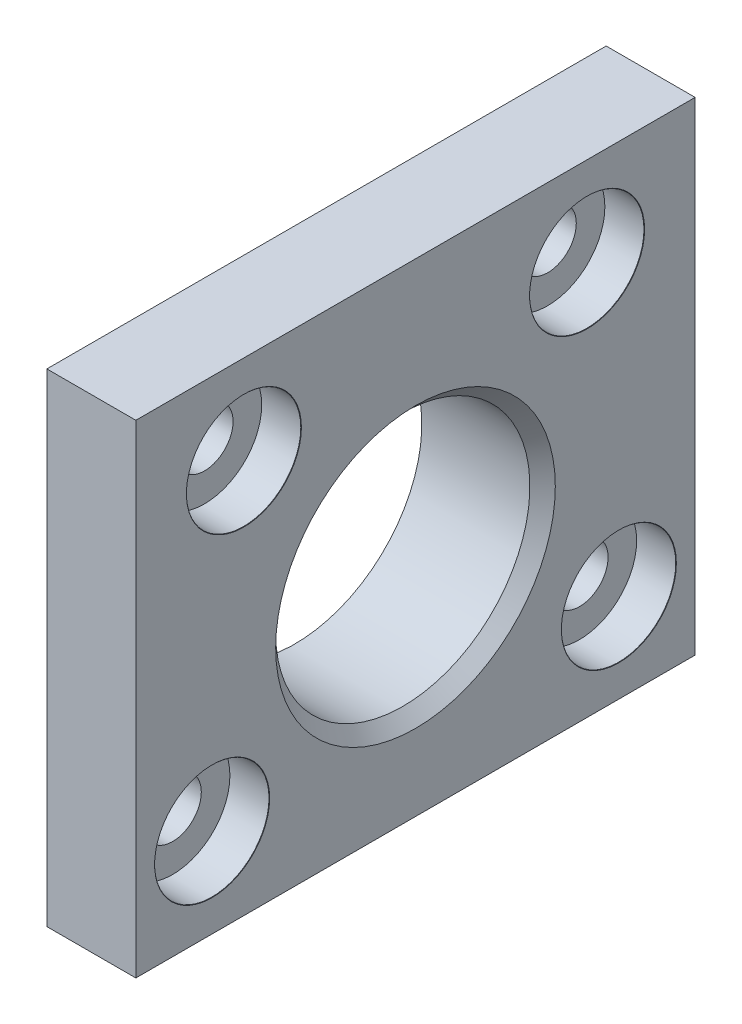
ISO-10303-21;
HEADER;
FILE_DESCRIPTION(('STEP AP214'),'2;1');
FILE_NAME('part.step','',(''),(''),'','','');
FILE_SCHEMA(('AUTOMOTIVE_DESIGN { 1 0 10303 214 1 1 1 1 }'));
ENDSEC;
DATA;
#1=APPLICATION_CONTEXT('core data for automotive mechanical design processes');
#2=APPLICATION_PROTOCOL_DEFINITION('international standard','automotive_design',2000,#1);
#3=PRODUCT_CONTEXT('',#1,'mechanical');
#4=PRODUCT('Part','Part','',(#3));
#5=PRODUCT_RELATED_PRODUCT_CATEGORY('part','',(#4));
#6=PRODUCT_DEFINITION_FORMATION('','',#4);
#7=PRODUCT_DEFINITION_CONTEXT('part definition',#1,'design');
#8=PRODUCT_DEFINITION('design','',#6,#7);
#9=PRODUCT_DEFINITION_SHAPE('','',#8);
#10=(LENGTH_UNIT() NAMED_UNIT(*) SI_UNIT(.MILLI.,.METRE.));
#11=(NAMED_UNIT(*) PLANE_ANGLE_UNIT() SI_UNIT($,.RADIAN.));
#12=(NAMED_UNIT(*) SI_UNIT($,.STERADIAN.) SOLID_ANGLE_UNIT());
#13=UNCERTAINTY_MEASURE_WITH_UNIT(LENGTH_MEASURE(1.E-05),#10,'distance_accuracy_value','');
#14=(GEOMETRIC_REPRESENTATION_CONTEXT(3) GLOBAL_UNCERTAINTY_ASSIGNED_CONTEXT((#13)) GLOBAL_UNIT_ASSIGNED_CONTEXT((#10,
#11,#12)) REPRESENTATION_CONTEXT('',''));
#15=CARTESIAN_POINT('',(0.,0.,0.));
#16=DIRECTION('',(0.,0.,1.));
#17=DIRECTION('',(1.,0.,0.));
#18=AXIS2_PLACEMENT_3D('',#15,#16,#17);
#19=CARTESIAN_POINT('',(-7.,0.,0.));
#20=DIRECTION('',(-1.,0.,0.));
#21=DIRECTION('',(0.,0.,1.));
#22=AXIS2_PLACEMENT_3D('',#19,#20,#21);
#23=PLANE('',#22);
#24=CARTESIAN_POINT('',(-7.,31.,-8.5));
#25=DIRECTION('',(-1.,0.,0.));
#26=DIRECTION('',(0.,0.,1.));
#27=AXIS2_PLACEMENT_3D('',#24,#25,#26);
#28=CIRCLE('',#27,2.25);
#29=CARTESIAN_POINT('',(-7.,31.,-6.25));
#30=VERTEX_POINT('',#29);
#31=EDGE_CURVE('E45',#30,#30,#28,.T.);
#32=ORIENTED_EDGE('',*,*,#31,.F.);
#33=EDGE_LOOP('',(#32));
#34=FACE_BOUND('',#33,.T.);
#35=CARTESIAN_POINT('',(-7.,31.,-35.5));
#36=DIRECTION('',(-1.,0.,0.));
#37=DIRECTION('',(0.,0.,1.));
#38=AXIS2_PLACEMENT_3D('',#35,#36,#37);
#39=CIRCLE('',#38,2.25);
#40=CARTESIAN_POINT('',(-7.,31.,-33.25));
#41=VERTEX_POINT('',#40);
#42=EDGE_CURVE('E151',#41,#41,#39,.T.);
#43=ORIENTED_EDGE('',*,*,#42,.F.);
#44=EDGE_LOOP('',(#43));
#45=FACE_BOUND('',#44,.T.);
#46=CARTESIAN_POINT('',(-7.,7.,-38.));
#47=DIRECTION('',(-1.,0.,0.));
#48=DIRECTION('',(0.,0.,1.));
#49=AXIS2_PLACEMENT_3D('',#46,#47,#48);
#50=CIRCLE('',#49,2.25);
#51=CARTESIAN_POINT('',(-7.,7.,-35.75));
#52=VERTEX_POINT('',#51);
#53=EDGE_CURVE('E146',#52,#52,#50,.T.);
#54=ORIENTED_EDGE('',*,*,#53,.F.);
#55=EDGE_LOOP('',(#54));
#56=FACE_BOUND('',#55,.T.);
#57=CARTESIAN_POINT('',(-7.,7.,-6.));
#58=DIRECTION('',(-1.,0.,0.));
#59=DIRECTION('',(0.,0.,1.));
#60=AXIS2_PLACEMENT_3D('',#57,#58,#59);
#61=CIRCLE('',#60,2.25);
#62=CARTESIAN_POINT('',(-7.,7.,-3.75));
#63=VERTEX_POINT('',#62);
#64=EDGE_CURVE('E140',#63,#63,#61,.T.);
#65=ORIENTED_EDGE('',*,*,#64,.F.);
#66=EDGE_LOOP('',(#65));
#67=FACE_BOUND('',#66,.T.);
#68=DIRECTION('',(0.,1.,0.));
#69=VECTOR('',#68,1.);
#70=CARTESIAN_POINT('',(-7.,38.,-44.));
#71=LINE('',#70,#69);
#72=CARTESIAN_POINT('',(-7.,0.,-44.));
#73=VERTEX_POINT('',#72);
#74=CARTESIAN_POINT('',(-7.,38.,-44.));
#75=VERTEX_POINT('',#74);
#76=EDGE_CURVE('E109',#73,#75,#71,.T.);
#77=ORIENTED_EDGE('',*,*,#76,.F.);
#78=DIRECTION('',(0.,0.,-1.));
#79=VECTOR('',#78,1.);
#80=CARTESIAN_POINT('',(-7.,0.,-44.));
#81=LINE('',#80,#79);
#82=CARTESIAN_POINT('',(-7.,0.,0.));
#83=VERTEX_POINT('',#82);
#84=EDGE_CURVE('E104',#83,#73,#81,.T.);
#85=ORIENTED_EDGE('',*,*,#84,.F.);
#86=DIRECTION('',(0.,-1.,0.));
#87=VECTOR('',#86,1.);
#88=CARTESIAN_POINT('',(-7.,38.,0.));
#89=LINE('',#88,#87);
#90=CARTESIAN_POINT('',(-7.,38.,0.));
#91=VERTEX_POINT('',#90);
#92=EDGE_CURVE('E95',#91,#83,#89,.T.);
#93=ORIENTED_EDGE('',*,*,#92,.F.);
#94=DIRECTION('',(0.,0.,1.));
#95=VECTOR('',#94,1.);
#96=CARTESIAN_POINT('',(-7.,38.,-44.));
#97=LINE('',#96,#95);
#98=EDGE_CURVE('E103',#75,#91,#97,.T.);
#99=ORIENTED_EDGE('',*,*,#98,.F.);
#100=EDGE_LOOP('',(#77,#85,#93,#99));
#101=FACE_BOUND('',#100,.T.);
#102=CARTESIAN_POINT('',(-7.,17.,-22.));
#103=DIRECTION('',(-1.,0.,0.));
#104=DIRECTION('',(0.,0.,1.));
#105=AXIS2_PLACEMENT_3D('',#102,#103,#104);
#106=CIRCLE('',#105,15.4);
#107=CARTESIAN_POINT('',(-7.,17.,-6.6));
#108=VERTEX_POINT('',#107);
#109=EDGE_CURVE('E201',#108,#108,#106,.T.);
#110=ORIENTED_EDGE('',*,*,#109,.F.);
#111=EDGE_LOOP('',(#110));
#112=FACE_BOUND('',#111,.T.);
#113=ADVANCED_FACE('F40',(#34,#45,#56,#67,#101,#112),#23,.T.);
#114=CARTESIAN_POINT('',(-7.,38.,-44.));
#115=DIRECTION('',(0.,0.,-1.));
#116=DIRECTION('',(0.,1.,0.));
#117=AXIS2_PLACEMENT_3D('',#114,#115,#116);
#118=PLANE('',#117);
#119=DIRECTION('',(0.,1.,0.));
#120=VECTOR('',#119,1.);
#121=CARTESIAN_POINT('',(0.,38.,-44.));
#122=LINE('',#121,#120);
#123=CARTESIAN_POINT('',(0.,0.,-44.));
#124=VERTEX_POINT('',#123);
#125=CARTESIAN_POINT('',(0.,38.,-44.));
#126=VERTEX_POINT('',#125);
#127=EDGE_CURVE('E118',#124,#126,#122,.T.);
#128=ORIENTED_EDGE('',*,*,#127,.F.);
#129=DIRECTION('',(1.,0.,0.));
#130=VECTOR('',#129,1.);
#131=CARTESIAN_POINT('',(-7.,0.,-44.));
#132=LINE('',#131,#130);
#133=EDGE_CURVE('E61',#73,#124,#132,.T.);
#134=ORIENTED_EDGE('',*,*,#133,.F.);
#135=ORIENTED_EDGE('',*,*,#76,.T.);
#136=DIRECTION('',(1.,0.,0.));
#137=VECTOR('',#136,1.);
#138=CARTESIAN_POINT('',(-7.,38.,-44.));
#139=LINE('',#138,#137);
#140=EDGE_CURVE('E89',#75,#126,#139,.T.);
#141=ORIENTED_EDGE('',*,*,#140,.T.);
#142=EDGE_LOOP('',(#128,#134,#135,#141));
#143=FACE_BOUND('',#142,.T.);
#144=ADVANCED_FACE('F210',(#143),#118,.T.);
#145=CARTESIAN_POINT('',(-7.,0.,-44.));
#146=DIRECTION('',(0.,-1.,0.));
#147=DIRECTION('',(0.,0.,-1.));
#148=AXIS2_PLACEMENT_3D('',#145,#146,#147);
#149=PLANE('',#148);
#150=DIRECTION('',(0.,0.,-1.));
#151=VECTOR('',#150,1.);
#152=CARTESIAN_POINT('',(0.,0.,-44.));
#153=LINE('',#152,#151);
#154=CARTESIAN_POINT('',(0.,0.,0.));
#155=VERTEX_POINT('',#154);
#156=EDGE_CURVE('E112',#155,#124,#153,.T.);
#157=ORIENTED_EDGE('',*,*,#156,.F.);
#158=DIRECTION('',(1.,0.,0.));
#159=VECTOR('',#158,1.);
#160=CARTESIAN_POINT('',(-7.,0.,0.));
#161=LINE('',#160,#159);
#162=EDGE_CURVE('E78',#83,#155,#161,.T.);
#163=ORIENTED_EDGE('',*,*,#162,.F.);
#164=ORIENTED_EDGE('',*,*,#84,.T.);
#165=ORIENTED_EDGE('',*,*,#133,.T.);
#166=EDGE_LOOP('',(#157,#163,#164,#165));
#167=FACE_BOUND('',#166,.T.);
#168=ADVANCED_FACE('F218',(#167),#149,.T.);
#169=CARTESIAN_POINT('',(-7.,38.,0.));
#170=DIRECTION('',(0.,0.,1.));
#171=DIRECTION('',(0.,-1.,0.));
#172=AXIS2_PLACEMENT_3D('',#169,#170,#171);
#173=PLANE('',#172);
#174=DIRECTION('',(0.,-1.,0.));
#175=VECTOR('',#174,1.);
#176=CARTESIAN_POINT('',(0.,38.,0.));
#177=LINE('',#176,#175);
#178=CARTESIAN_POINT('',(0.,38.,0.));
#179=VERTEX_POINT('',#178);
#180=EDGE_CURVE('E97',#179,#155,#177,.T.);
#181=ORIENTED_EDGE('',*,*,#180,.F.);
#182=DIRECTION('',(1.,0.,0.));
#183=VECTOR('',#182,1.);
#184=CARTESIAN_POINT('',(-7.,38.,0.));
#185=LINE('',#184,#183);
#186=EDGE_CURVE('E92',#91,#179,#185,.T.);
#187=ORIENTED_EDGE('',*,*,#186,.F.);
#188=ORIENTED_EDGE('',*,*,#92,.T.);
#189=ORIENTED_EDGE('',*,*,#162,.T.);
#190=EDGE_LOOP('',(#181,#187,#188,#189));
#191=FACE_BOUND('',#190,.T.);
#192=ADVANCED_FACE('F94',(#191),#173,.T.);
#193=CARTESIAN_POINT('',(-7.,38.,-44.));
#194=DIRECTION('',(0.,1.,0.));
#195=DIRECTION('',(0.,0.,1.));
#196=AXIS2_PLACEMENT_3D('',#193,#194,#195);
#197=PLANE('',#196);
#198=DIRECTION('',(0.,0.,1.));
#199=VECTOR('',#198,1.);
#200=CARTESIAN_POINT('',(0.,38.,-44.));
#201=LINE('',#200,#199);
#202=EDGE_CURVE('E122',#126,#179,#201,.T.);
#203=ORIENTED_EDGE('',*,*,#202,.F.);
#204=ORIENTED_EDGE('',*,*,#140,.F.);
#205=ORIENTED_EDGE('',*,*,#98,.T.);
#206=ORIENTED_EDGE('',*,*,#186,.T.);
#207=EDGE_LOOP('',(#203,#204,#205,#206));
#208=FACE_BOUND('',#207,.T.);
#209=ADVANCED_FACE('F107',(#208),#197,.T.);
#210=CARTESIAN_POINT('',(0.,0.,0.));
#211=DIRECTION('',(-1.,0.,0.));
#212=DIRECTION('',(0.,0.,1.));
#213=AXIS2_PLACEMENT_3D('',#210,#211,#212);
#214=PLANE('',#213);
#215=CARTESIAN_POINT('',(0.,31.,-8.5));
#216=DIRECTION('',(1.,0.,0.));
#217=DIRECTION('',(0.,0.,-1.));
#218=AXIS2_PLACEMENT_3D('',#215,#216,#217);
#219=CIRCLE('',#218,4.525);
#220=CARTESIAN_POINT('',(0.,31.,-13.025));
#221=VERTEX_POINT('',#220);
#222=EDGE_CURVE('E468',#221,#221,#219,.T.);
#223=ORIENTED_EDGE('',*,*,#222,.F.);
#224=EDGE_LOOP('',(#223));
#225=FACE_BOUND('',#224,.T.);
#226=CARTESIAN_POINT('',(0.,31.,-35.5));
#227=DIRECTION('',(1.,0.,0.));
#228=DIRECTION('',(0.,0.,-1.));
#229=AXIS2_PLACEMENT_3D('',#226,#227,#228);
#230=CIRCLE('',#229,4.525);
#231=CARTESIAN_POINT('',(0.,31.,-40.025));
#232=VERTEX_POINT('',#231);
#233=EDGE_CURVE('E482',#232,#232,#230,.T.);
#234=ORIENTED_EDGE('',*,*,#233,.F.);
#235=EDGE_LOOP('',(#234));
#236=FACE_BOUND('',#235,.T.);
#237=CARTESIAN_POINT('',(0.,7.,-38.));
#238=DIRECTION('',(1.,0.,0.));
#239=DIRECTION('',(0.,0.,-1.));
#240=AXIS2_PLACEMENT_3D('',#237,#238,#239);
#241=CIRCLE('',#240,4.525);
#242=CARTESIAN_POINT('',(0.,7.,-42.525));
#243=VERTEX_POINT('',#242);
#244=EDGE_CURVE('E154',#243,#243,#241,.T.);
#245=ORIENTED_EDGE('',*,*,#244,.F.);
#246=EDGE_LOOP('',(#245));
#247=FACE_BOUND('',#246,.T.);
#248=CARTESIAN_POINT('',(0.,7.,-6.));
#249=DIRECTION('',(1.,0.,0.));
#250=DIRECTION('',(0.,0.,-1.));
#251=AXIS2_PLACEMENT_3D('',#248,#249,#250);
#252=CIRCLE('',#251,4.525);
#253=CARTESIAN_POINT('',(0.,7.,-10.525));
#254=VERTEX_POINT('',#253);
#255=EDGE_CURVE('E149',#254,#254,#252,.T.);
#256=ORIENTED_EDGE('',*,*,#255,.F.);
#257=EDGE_LOOP('',(#256));
#258=FACE_BOUND('',#257,.T.);
#259=CARTESIAN_POINT('',(0.,17.,-22.));
#260=DIRECTION('',(-1.,0.,0.));
#261=DIRECTION('',(0.,0.,1.));
#262=AXIS2_PLACEMENT_3D('',#259,#260,#261);
#263=CIRCLE('',#262,11.);
#264=CARTESIAN_POINT('',(0.,17.,-11.));
#265=VERTEX_POINT('',#264);
#266=EDGE_CURVE('E11',#265,#265,#263,.T.);
#267=ORIENTED_EDGE('',*,*,#266,.T.);
#268=EDGE_LOOP('',(#267));
#269=FACE_BOUND('',#268,.T.);
#270=ORIENTED_EDGE('',*,*,#127,.T.);
#271=ORIENTED_EDGE('',*,*,#202,.T.);
#272=ORIENTED_EDGE('',*,*,#180,.T.);
#273=ORIENTED_EDGE('',*,*,#156,.T.);
#274=EDGE_LOOP('',(#270,#271,#272,#273));
#275=FACE_BOUND('',#274,.T.);
#276=ADVANCED_FACE('F225',(#225,#236,#247,#258,#269,#275),#214,.F.);
#277=CARTESIAN_POINT('',(-7.,17.,-22.));
#278=DIRECTION('',(1.,0.,0.));
#279=DIRECTION('',(0.,0.,-1.));
#280=AXIS2_PLACEMENT_3D('',#277,#278,#279);
#281=CYLINDRICAL_SURFACE('',#280,10.);
#282=CARTESIAN_POINT('',(-1.,17.,-22.));
#283=DIRECTION('',(-1.,0.,0.));
#284=DIRECTION('',(0.,0.,1.));
#285=AXIS2_PLACEMENT_3D('',#282,#283,#284);
#286=CIRCLE('',#285,10.);
#287=CARTESIAN_POINT('',(-1.,17.,-12.));
#288=VERTEX_POINT('',#287);
#289=EDGE_CURVE('E52',#288,#288,#286,.F.);
#290=ORIENTED_EDGE('',*,*,#289,.T.);
#291=EDGE_LOOP('',(#290));
#292=FACE_BOUND('',#291,.T.);
#293=CARTESIAN_POINT('',(-9.5,17.,-22.));
#294=DIRECTION('',(-1.,0.,0.));
#295=DIRECTION('',(0.,0.,1.));
#296=AXIS2_PLACEMENT_3D('',#293,#294,#295);
#297=CIRCLE('',#296,10.);
#298=CARTESIAN_POINT('',(-9.5,17.,-12.));
#299=VERTEX_POINT('',#298);
#300=EDGE_CURVE('E144',#299,#299,#297,.T.);
#301=ORIENTED_EDGE('',*,*,#300,.T.);
#302=EDGE_LOOP('',(#301));
#303=FACE_BOUND('',#302,.T.);
#304=ADVANCED_FACE('F223',(#292,#303),#281,.F.);
#305=CARTESIAN_POINT('',(-9.5,17.,-22.));
#306=DIRECTION('',(-1.,0.,0.));
#307=DIRECTION('',(0.,0.,1.));
#308=AXIS2_PLACEMENT_3D('',#305,#306,#307);
#309=PLANE('',#308);
#310=CARTESIAN_POINT('',(-9.5,17.,-22.));
#311=DIRECTION('',(-1.,0.,0.));
#312=DIRECTION('',(0.,0.,1.));
#313=AXIS2_PLACEMENT_3D('',#310,#311,#312);
#314=CIRCLE('',#313,15.4);
#315=CARTESIAN_POINT('',(-9.5,17.,-6.6));
#316=VERTEX_POINT('',#315);
#317=EDGE_CURVE('E123',#316,#316,#314,.T.);
#318=ORIENTED_EDGE('',*,*,#317,.T.);
#319=EDGE_LOOP('',(#318));
#320=FACE_BOUND('',#319,.T.);
#321=ORIENTED_EDGE('',*,*,#300,.F.);
#322=EDGE_LOOP('',(#321));
#323=FACE_BOUND('',#322,.T.);
#324=ADVANCED_FACE('F252',(#320,#323),#309,.T.);
#325=CARTESIAN_POINT('',(-9.5,17.,-22.));
#326=DIRECTION('',(1.,0.,0.));
#327=DIRECTION('',(0.,0.,-1.));
#328=AXIS2_PLACEMENT_3D('',#325,#326,#327);
#329=CYLINDRICAL_SURFACE('',#328,15.4);
#330=ORIENTED_EDGE('',*,*,#317,.F.);
#331=EDGE_LOOP('',(#330));
#332=FACE_BOUND('',#331,.T.);
#333=ORIENTED_EDGE('',*,*,#109,.T.);
#334=EDGE_LOOP('',(#333));
#335=FACE_BOUND('',#334,.T.);
#336=ADVANCED_FACE('F208',(#332,#335),#329,.T.);
#337=CARTESIAN_POINT('',(-1.,17.,-22.));
#338=DIRECTION('',(1.,0.,0.));
#339=DIRECTION('',(0.,0.,-1.));
#340=AXIS2_PLACEMENT_3D('',#337,#338,#339);
#341=CONICAL_SURFACE('',#340,10.,0.785398163397448);
#342=ORIENTED_EDGE('',*,*,#266,.F.);
#343=EDGE_LOOP('',(#342));
#344=FACE_BOUND('',#343,.T.);
#345=ORIENTED_EDGE('',*,*,#289,.F.);
#346=EDGE_LOOP('',(#345));
#347=FACE_BOUND('',#346,.T.);
#348=ADVANCED_FACE('F43',(#344,#347),#341,.F.);
#349=CARTESIAN_POINT('',(0.,7.,-6.));
#350=DIRECTION('',(1.,0.,0.));
#351=DIRECTION('',(0.,0.,-1.));
#352=AXIS2_PLACEMENT_3D('',#349,#350,#351);
#353=CYLINDRICAL_SURFACE('',#352,2.25);
#354=ORIENTED_EDGE('',*,*,#64,.T.);
#355=EDGE_LOOP('',(#354));
#356=FACE_BOUND('',#355,.T.);
#357=CARTESIAN_POINT('',(-3.1,7.,-6.));
#358=DIRECTION('',(1.,0.,0.));
#359=DIRECTION('',(0.,0.,-1.));
#360=AXIS2_PLACEMENT_3D('',#357,#358,#359);
#361=CIRCLE('',#360,2.25);
#362=CARTESIAN_POINT('',(-3.1,7.,-8.25));
#363=VERTEX_POINT('',#362);
#364=EDGE_CURVE('E145',#363,#363,#361,.T.);
#365=ORIENTED_EDGE('',*,*,#364,.T.);
#366=EDGE_LOOP('',(#365));
#367=FACE_BOUND('',#366,.T.);
#368=ADVANCED_FACE('F270',(#356,#367),#353,.F.);
#369=CARTESIAN_POINT('',(-3.1,11.5,-6.));
#370=DIRECTION('',(-1.,0.,0.));
#371=DIRECTION('',(0.,0.,1.));
#372=AXIS2_PLACEMENT_3D('',#369,#370,#371);
#373=PLANE('',#372);
#374=ORIENTED_EDGE('',*,*,#364,.F.);
#375=EDGE_LOOP('',(#374));
#376=FACE_BOUND('',#375,.T.);
#377=CARTESIAN_POINT('',(-3.1,7.,-6.));
#378=DIRECTION('',(1.,0.,0.));
#379=DIRECTION('',(0.,0.,-1.));
#380=AXIS2_PLACEMENT_3D('',#377,#378,#379);
#381=CIRCLE('',#380,4.5);
#382=CARTESIAN_POINT('',(-3.1,7.,-10.5));
#383=VERTEX_POINT('',#382);
#384=EDGE_CURVE('E191',#383,#383,#381,.T.);
#385=ORIENTED_EDGE('',*,*,#384,.T.);
#386=EDGE_LOOP('',(#385));
#387=FACE_BOUND('',#386,.T.);
#388=ADVANCED_FACE('F276',(#376,#387),#373,.F.);
#389=CARTESIAN_POINT('',(0.,7.,-6.));
#390=DIRECTION('',(1.,0.,0.));
#391=DIRECTION('',(0.,0.,-1.));
#392=AXIS2_PLACEMENT_3D('',#389,#390,#391);
#393=CYLINDRICAL_SURFACE('',#392,4.5);
#394=ORIENTED_EDGE('',*,*,#384,.F.);
#395=EDGE_LOOP('',(#394));
#396=FACE_BOUND('',#395,.T.);
#397=CARTESIAN_POINT('',(-0.0250000000000003,7.,-6.));
#398=DIRECTION('',(1.,0.,0.));
#399=DIRECTION('',(0.,0.,-1.));
#400=AXIS2_PLACEMENT_3D('',#397,#398,#399);
#401=CIRCLE('',#400,4.5);
#402=CARTESIAN_POINT('',(-0.0250000000000003,7.,-10.5));
#403=VERTEX_POINT('',#402);
#404=EDGE_CURVE('E187',#403,#403,#401,.T.);
#405=ORIENTED_EDGE('',*,*,#404,.T.);
#406=EDGE_LOOP('',(#405));
#407=FACE_BOUND('',#406,.T.);
#408=ADVANCED_FACE('F284',(#396,#407),#393,.F.);
#409=CARTESIAN_POINT('',(0.,7.,-6.));
#410=DIRECTION('',(1.,0.,0.));
#411=DIRECTION('',(0.,0.,-1.));
#412=AXIS2_PLACEMENT_3D('',#409,#410,#411);
#413=CONICAL_SURFACE('',#412,4.525,0.785398163397457);
#414=ORIENTED_EDGE('',*,*,#404,.F.);
#415=EDGE_LOOP('',(#414));
#416=FACE_BOUND('',#415,.T.);
#417=ORIENTED_EDGE('',*,*,#255,.T.);
#418=EDGE_LOOP('',(#417));
#419=FACE_BOUND('',#418,.T.);
#420=ADVANCED_FACE('F292',(#416,#419),#413,.F.);
#421=CARTESIAN_POINT('',(0.,7.,-38.));
#422=DIRECTION('',(1.,0.,0.));
#423=DIRECTION('',(0.,0.,-1.));
#424=AXIS2_PLACEMENT_3D('',#421,#422,#423);
#425=CYLINDRICAL_SURFACE('',#424,2.25);
#426=ORIENTED_EDGE('',*,*,#53,.T.);
#427=EDGE_LOOP('',(#426));
#428=FACE_BOUND('',#427,.T.);
#429=CARTESIAN_POINT('',(-3.1,7.,-38.));
#430=DIRECTION('',(1.,0.,0.));
#431=DIRECTION('',(0.,0.,-1.));
#432=AXIS2_PLACEMENT_3D('',#429,#430,#431);
#433=CIRCLE('',#432,2.25);
#434=CARTESIAN_POINT('',(-3.1,7.,-40.25));
#435=VERTEX_POINT('',#434);
#436=EDGE_CURVE('E150',#435,#435,#433,.T.);
#437=ORIENTED_EDGE('',*,*,#436,.T.);
#438=EDGE_LOOP('',(#437));
#439=FACE_BOUND('',#438,.T.);
#440=ADVANCED_FACE('F300',(#428,#439),#425,.F.);
#441=CARTESIAN_POINT('',(-3.1,11.5,-38.));
#442=DIRECTION('',(-1.,0.,0.));
#443=DIRECTION('',(0.,0.,1.));
#444=AXIS2_PLACEMENT_3D('',#441,#442,#443);
#445=PLANE('',#444);
#446=ORIENTED_EDGE('',*,*,#436,.F.);
#447=EDGE_LOOP('',(#446));
#448=FACE_BOUND('',#447,.T.);
#449=CARTESIAN_POINT('',(-3.1,7.,-38.));
#450=DIRECTION('',(1.,0.,0.));
#451=DIRECTION('',(0.,0.,-1.));
#452=AXIS2_PLACEMENT_3D('',#449,#450,#451);
#453=CIRCLE('',#452,4.5);
#454=CARTESIAN_POINT('',(-3.1,7.,-42.5));
#455=VERTEX_POINT('',#454);
#456=EDGE_CURVE('E177',#455,#455,#453,.T.);
#457=ORIENTED_EDGE('',*,*,#456,.T.);
#458=EDGE_LOOP('',(#457));
#459=FACE_BOUND('',#458,.T.);
#460=ADVANCED_FACE('F308',(#448,#459),#445,.F.);
#461=CARTESIAN_POINT('',(0.,7.,-38.));
#462=DIRECTION('',(1.,0.,0.));
#463=DIRECTION('',(0.,0.,-1.));
#464=AXIS2_PLACEMENT_3D('',#461,#462,#463);
#465=CYLINDRICAL_SURFACE('',#464,4.5);
#466=ORIENTED_EDGE('',*,*,#456,.F.);
#467=EDGE_LOOP('',(#466));
#468=FACE_BOUND('',#467,.T.);
#469=CARTESIAN_POINT('',(-0.0250000000000003,7.,-38.));
#470=DIRECTION('',(1.,0.,0.));
#471=DIRECTION('',(0.,0.,-1.));
#472=AXIS2_PLACEMENT_3D('',#469,#470,#471);
#473=CIRCLE('',#472,4.5);
#474=CARTESIAN_POINT('',(-0.0250000000000003,7.,-42.5));
#475=VERTEX_POINT('',#474);
#476=EDGE_CURVE('E161',#475,#475,#473,.T.);
#477=ORIENTED_EDGE('',*,*,#476,.T.);
#478=EDGE_LOOP('',(#477));
#479=FACE_BOUND('',#478,.T.);
#480=ADVANCED_FACE('F316',(#468,#479),#465,.F.);
#481=CARTESIAN_POINT('',(0.,7.,-38.));
#482=DIRECTION('',(1.,0.,0.));
#483=DIRECTION('',(0.,0.,-1.));
#484=AXIS2_PLACEMENT_3D('',#481,#482,#483);
#485=CONICAL_SURFACE('',#484,4.525,0.785398163397457);
#486=ORIENTED_EDGE('',*,*,#476,.F.);
#487=EDGE_LOOP('',(#486));
#488=FACE_BOUND('',#487,.T.);
#489=ORIENTED_EDGE('',*,*,#244,.T.);
#490=EDGE_LOOP('',(#489));
#491=FACE_BOUND('',#490,.T.);
#492=ADVANCED_FACE('F324',(#488,#491),#485,.F.);
#493=CARTESIAN_POINT('',(0.,31.,-35.5));
#494=DIRECTION('',(1.,0.,0.));
#495=DIRECTION('',(0.,0.,-1.));
#496=AXIS2_PLACEMENT_3D('',#493,#494,#495);
#497=CYLINDRICAL_SURFACE('',#496,2.25);
#498=ORIENTED_EDGE('',*,*,#42,.T.);
#499=EDGE_LOOP('',(#498));
#500=FACE_BOUND('',#499,.T.);
#501=CARTESIAN_POINT('',(-3.1,31.,-35.5));
#502=DIRECTION('',(1.,0.,0.));
#503=DIRECTION('',(0.,0.,-1.));
#504=AXIS2_PLACEMENT_3D('',#501,#502,#503);
#505=CIRCLE('',#504,2.25);
#506=CARTESIAN_POINT('',(-3.1,31.,-37.75));
#507=VERTEX_POINT('',#506);
#508=EDGE_CURVE('E155',#507,#507,#505,.T.);
#509=ORIENTED_EDGE('',*,*,#508,.T.);
#510=EDGE_LOOP('',(#509));
#511=FACE_BOUND('',#510,.T.);
#512=ADVANCED_FACE('F332',(#500,#511),#497,.F.);
#513=CARTESIAN_POINT('',(-3.1,35.5,-35.5));
#514=DIRECTION('',(-1.,0.,0.));
#515=DIRECTION('',(0.,0.,1.));
#516=AXIS2_PLACEMENT_3D('',#513,#514,#515);
#517=PLANE('',#516);
#518=ORIENTED_EDGE('',*,*,#508,.F.);
#519=EDGE_LOOP('',(#518));
#520=FACE_BOUND('',#519,.T.);
#521=CARTESIAN_POINT('',(-3.1,31.,-35.5));
#522=DIRECTION('',(1.,0.,0.));
#523=DIRECTION('',(0.,0.,-1.));
#524=AXIS2_PLACEMENT_3D('',#521,#522,#523);
#525=CIRCLE('',#524,4.5);
#526=CARTESIAN_POINT('',(-3.1,31.,-40.));
#527=VERTEX_POINT('',#526);
#528=EDGE_CURVE('E164',#527,#527,#525,.T.);
#529=ORIENTED_EDGE('',*,*,#528,.T.);
#530=EDGE_LOOP('',(#529));
#531=FACE_BOUND('',#530,.T.);
#532=ADVANCED_FACE('F340',(#520,#531),#517,.F.);
#533=CARTESIAN_POINT('',(0.,31.,-35.5));
#534=DIRECTION('',(1.,0.,0.));
#535=DIRECTION('',(0.,0.,-1.));
#536=AXIS2_PLACEMENT_3D('',#533,#534,#535);
#537=CYLINDRICAL_SURFACE('',#536,4.5);
#538=ORIENTED_EDGE('',*,*,#528,.F.);
#539=EDGE_LOOP('',(#538));
#540=FACE_BOUND('',#539,.T.);
#541=CARTESIAN_POINT('',(-0.0250000000000003,31.,-35.5));
#542=DIRECTION('',(1.,0.,0.));
#543=DIRECTION('',(0.,0.,-1.));
#544=AXIS2_PLACEMENT_3D('',#541,#542,#543);
#545=CIRCLE('',#544,4.5);
#546=CARTESIAN_POINT('',(-0.0250000000000003,31.,-40.));
#547=VERTEX_POINT('',#546);
#548=EDGE_CURVE('E170',#547,#547,#545,.T.);
#549=ORIENTED_EDGE('',*,*,#548,.T.);
#550=EDGE_LOOP('',(#549));
#551=FACE_BOUND('',#550,.T.);
#552=ADVANCED_FACE('F347',(#540,#551),#537,.F.);
#553=CARTESIAN_POINT('',(0.,31.,-35.5));
#554=DIRECTION('',(1.,0.,0.));
#555=DIRECTION('',(0.,0.,-1.));
#556=AXIS2_PLACEMENT_3D('',#553,#554,#555);
#557=CONICAL_SURFACE('',#556,4.525,0.785398163397526);
#558=ORIENTED_EDGE('',*,*,#548,.F.);
#559=EDGE_LOOP('',(#558));
#560=FACE_BOUND('',#559,.T.);
#561=ORIENTED_EDGE('',*,*,#233,.T.);
#562=EDGE_LOOP('',(#561));
#563=FACE_BOUND('',#562,.T.);
#564=ADVANCED_FACE('F355',(#560,#563),#557,.F.);
#565=CARTESIAN_POINT('',(0.,31.,-8.5));
#566=DIRECTION('',(1.,0.,0.));
#567=DIRECTION('',(0.,0.,-1.));
#568=AXIS2_PLACEMENT_3D('',#565,#566,#567);
#569=CYLINDRICAL_SURFACE('',#568,2.25);
#570=ORIENTED_EDGE('',*,*,#31,.T.);
#571=EDGE_LOOP('',(#570));
#572=FACE_BOUND('',#571,.T.);
#573=CARTESIAN_POINT('',(-3.1,31.,-8.5));
#574=DIRECTION('',(1.,0.,0.));
#575=DIRECTION('',(0.,0.,-1.));
#576=AXIS2_PLACEMENT_3D('',#573,#574,#575);
#577=CIRCLE('',#576,2.25);
#578=CARTESIAN_POINT('',(-3.1,31.,-10.75));
#579=VERTEX_POINT('',#578);
#580=EDGE_CURVE('E478',#579,#579,#577,.T.);
#581=ORIENTED_EDGE('',*,*,#580,.T.);
#582=EDGE_LOOP('',(#581));
#583=FACE_BOUND('',#582,.T.);
#584=ADVANCED_FACE('F363',(#572,#583),#569,.F.);
#585=CARTESIAN_POINT('',(-3.1,35.5,-8.5));
#586=DIRECTION('',(-1.,0.,0.));
#587=DIRECTION('',(0.,0.,1.));
#588=AXIS2_PLACEMENT_3D('',#585,#586,#587);
#589=PLANE('',#588);
#590=ORIENTED_EDGE('',*,*,#580,.F.);
#591=EDGE_LOOP('',(#590));
#592=FACE_BOUND('',#591,.T.);
#593=CARTESIAN_POINT('',(-3.1,31.,-8.5));
#594=DIRECTION('',(1.,0.,0.));
#595=DIRECTION('',(0.,0.,-1.));
#596=AXIS2_PLACEMENT_3D('',#593,#594,#595);
#597=CIRCLE('',#596,4.5);
#598=CARTESIAN_POINT('',(-3.1,31.,-13.));
#599=VERTEX_POINT('',#598);
#600=EDGE_CURVE('E472',#599,#599,#597,.T.);
#601=ORIENTED_EDGE('',*,*,#600,.T.);
#602=EDGE_LOOP('',(#601));
#603=FACE_BOUND('',#602,.T.);
#604=ADVANCED_FACE('F371',(#592,#603),#589,.F.);
#605=CARTESIAN_POINT('',(0.,31.,-8.5));
#606=DIRECTION('',(1.,0.,0.));
#607=DIRECTION('',(0.,0.,-1.));
#608=AXIS2_PLACEMENT_3D('',#605,#606,#607);
#609=CYLINDRICAL_SURFACE('',#608,4.5);
#610=ORIENTED_EDGE('',*,*,#600,.F.);
#611=EDGE_LOOP('',(#610));
#612=FACE_BOUND('',#611,.T.);
#613=CARTESIAN_POINT('',(-0.0250000000000003,31.,-8.5));
#614=DIRECTION('',(1.,0.,0.));
#615=DIRECTION('',(0.,0.,-1.));
#616=AXIS2_PLACEMENT_3D('',#613,#614,#615);
#617=CIRCLE('',#616,4.5);
#618=CARTESIAN_POINT('',(-0.0250000000000003,31.,-13.));
#619=VERTEX_POINT('',#618);
#620=EDGE_CURVE('E465',#619,#619,#617,.T.);
#621=ORIENTED_EDGE('',*,*,#620,.T.);
#622=EDGE_LOOP('',(#621));
#623=FACE_BOUND('',#622,.T.);
#624=ADVANCED_FACE('F379',(#612,#623),#609,.F.);
#625=CARTESIAN_POINT('',(0.,31.,-8.5));
#626=DIRECTION('',(1.,0.,0.));
#627=DIRECTION('',(0.,0.,-1.));
#628=AXIS2_PLACEMENT_3D('',#625,#626,#627);
#629=CONICAL_SURFACE('',#628,4.525,0.785398163397526);
#630=ORIENTED_EDGE('',*,*,#620,.F.);
#631=EDGE_LOOP('',(#630));
#632=FACE_BOUND('',#631,.T.);
#633=ORIENTED_EDGE('',*,*,#222,.T.);
#634=EDGE_LOOP('',(#633));
#635=FACE_BOUND('',#634,.T.);
#636=ADVANCED_FACE('F387',(#632,#635),#629,.F.);
#637=CLOSED_SHELL('',(#113,#144,#168,#192,#209,#276,#304,#324,#336,#348,#368,#388,#408,#420,
#440,#460,#480,#492,#512,#532,#552,#564,#584,#604,#624,#636));
#638=MANIFOLD_SOLID_BREP('B2',#637);
#639=ADVANCED_BREP_SHAPE_REPRESENTATION('',(#18,#638),#14);
#640=SHAPE_DEFINITION_REPRESENTATION(#9,#639);
ENDSEC;
END-ISO-10303-21;
